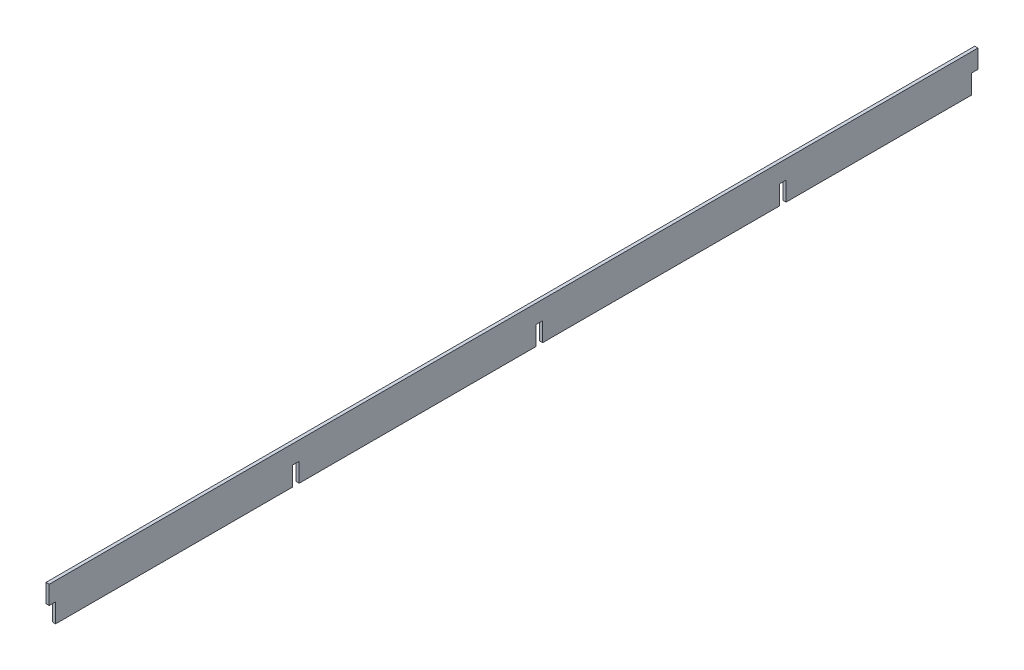
ISO-10303-21;
HEADER;
FILE_DESCRIPTION(('STEP AP214'),'2;1');
FILE_NAME('part.step','',(''),(''),'','','');
FILE_SCHEMA(('AUTOMOTIVE_DESIGN { 1 0 10303 214 1 1 1 1 }'));
ENDSEC;
DATA;
#1=APPLICATION_CONTEXT('core data for automotive mechanical design processes');
#2=APPLICATION_PROTOCOL_DEFINITION('international standard','automotive_design',2000,#1);
#3=PRODUCT_CONTEXT('',#1,'mechanical');
#4=PRODUCT('Part','Part','',(#3));
#5=PRODUCT_RELATED_PRODUCT_CATEGORY('part','',(#4));
#6=PRODUCT_DEFINITION_FORMATION('','',#4);
#7=PRODUCT_DEFINITION_CONTEXT('part definition',#1,'design');
#8=PRODUCT_DEFINITION('design','',#6,#7);
#9=PRODUCT_DEFINITION_SHAPE('','',#8);
#10=(LENGTH_UNIT() NAMED_UNIT(*) SI_UNIT(.MILLI.,.METRE.));
#11=(NAMED_UNIT(*) PLANE_ANGLE_UNIT() SI_UNIT($,.RADIAN.));
#12=(NAMED_UNIT(*) SI_UNIT($,.STERADIAN.) SOLID_ANGLE_UNIT());
#13=UNCERTAINTY_MEASURE_WITH_UNIT(LENGTH_MEASURE(1.E-05),#10,'distance_accuracy_value','');
#14=(GEOMETRIC_REPRESENTATION_CONTEXT(3) GLOBAL_UNCERTAINTY_ASSIGNED_CONTEXT((#13)) GLOBAL_UNIT_ASSIGNED_CONTEXT((#10,
#11,#12)) REPRESENTATION_CONTEXT('',''));
#15=CARTESIAN_POINT('',(0.,0.,0.));
#16=DIRECTION('',(0.,0.,1.));
#17=DIRECTION('',(1.,0.,0.));
#18=AXIS2_PLACEMENT_3D('',#15,#16,#17);
#19=CARTESIAN_POINT('',(788.475040211552,416.670628572467,-319.68119407791));
#20=DIRECTION('',(0.,0.,-1.));
#21=DIRECTION('',(1.,0.,0.));
#22=AXIS2_PLACEMENT_3D('',#19,#20,#21);
#23=PLANE('',#22);
#24=DIRECTION('',(0.,1.,0.));
#25=VECTOR('',#24,1.);
#26=CARTESIAN_POINT('',(330.901436240696,416.670628572467,-319.68119407791));
#27=LINE('',#26,#25);
#28=CARTESIAN_POINT('',(330.901436240696,416.670628572467,-319.68119407791));
#29=VERTEX_POINT('',#28);
#30=CARTESIAN_POINT('',(330.901436240696,425.766786018162,-319.68119407791));
#31=VERTEX_POINT('',#30);
#32=EDGE_CURVE('E245',#29,#31,#27,.T.);
#33=ORIENTED_EDGE('',*,*,#32,.T.);
#34=DIRECTION('',(-1.,0.,0.));
#35=VECTOR('',#34,1.);
#36=CARTESIAN_POINT('',(788.475040211552,425.766786018162,-319.68119407791));
#37=LINE('',#36,#35);
#38=CARTESIAN_POINT('',(329.313936240696,425.766786018162,-319.68119407791));
#39=VERTEX_POINT('',#38);
#40=EDGE_CURVE('E249',#31,#39,#37,.T.);
#41=ORIENTED_EDGE('',*,*,#40,.T.);
#42=DIRECTION('',(0.,1.,0.));
#43=VECTOR('',#42,1.);
#44=CARTESIAN_POINT('',(329.313936240696,416.670628572467,-319.68119407791));
#45=LINE('',#44,#43);
#46=CARTESIAN_POINT('',(329.313936240696,416.670628572467,-319.68119407791));
#47=VERTEX_POINT('',#46);
#48=EDGE_CURVE('E252',#47,#39,#45,.T.);
#49=ORIENTED_EDGE('',*,*,#48,.F.);
#50=DIRECTION('',(-1.,0.,0.));
#51=VECTOR('',#50,1.);
#52=CARTESIAN_POINT('',(788.475040211552,416.670628572467,-319.68119407791));
#53=LINE('',#52,#51);
#54=EDGE_CURVE('E39',#29,#47,#53,.T.);
#55=ORIENTED_EDGE('',*,*,#54,.F.);
#56=EDGE_LOOP('',(#33,#41,#49,#55));
#57=FACE_BOUND('',#56,.T.);
#58=ADVANCED_FACE('F35',(#57),#23,.F.);
#59=CARTESIAN_POINT('',(788.475040211552,425.766786018162,-773.70619407791));
#60=DIRECTION('',(0.,-1.,0.));
#61=DIRECTION('',(0.,0.,1.));
#62=AXIS2_PLACEMENT_3D('',#59,#60,#61);
#63=PLANE('',#62);
#64=DIRECTION('',(0.,0.,-1.));
#65=VECTOR('',#64,1.);
#66=CARTESIAN_POINT('',(330.901436240696,425.766786018162,-773.70619407791));
#67=LINE('',#66,#65);
#68=CARTESIAN_POINT('',(330.901436240696,425.766786018162,-776.88119407791));
#69=VERTEX_POINT('',#68);
#70=EDGE_CURVE('E148',#31,#69,#67,.T.);
#71=ORIENTED_EDGE('',*,*,#70,.T.);
#72=DIRECTION('',(-1.,0.,0.));
#73=VECTOR('',#72,1.);
#74=CARTESIAN_POINT('',(788.475040211552,425.766786018162,-776.88119407791));
#75=LINE('',#74,#73);
#76=CARTESIAN_POINT('',(329.313936240696,425.766786018162,-776.88119407791));
#77=VERTEX_POINT('',#76);
#78=EDGE_CURVE('E253',#69,#77,#75,.T.);
#79=ORIENTED_EDGE('',*,*,#78,.T.);
#80=DIRECTION('',(0.,0.,-1.));
#81=VECTOR('',#80,1.);
#82=CARTESIAN_POINT('',(329.313936240696,425.766786018162,-773.70619407791));
#83=LINE('',#82,#81);
#84=EDGE_CURVE('E139',#39,#77,#83,.T.);
#85=ORIENTED_EDGE('',*,*,#84,.F.);
#86=ORIENTED_EDGE('',*,*,#40,.F.);
#87=EDGE_LOOP('',(#71,#79,#85,#86));
#88=FACE_BOUND('',#87,.T.);
#89=ADVANCED_FACE('F351',(#88),#63,.F.);
#90=CARTESIAN_POINT('',(788.475040211552,425.766786018162,-776.88119407791));
#91=DIRECTION('',(0.,0.,1.));
#92=DIRECTION('',(-1.,0.,0.));
#93=AXIS2_PLACEMENT_3D('',#90,#91,#92);
#94=PLANE('',#93);
#95=DIRECTION('',(0.,-1.,0.));
#96=VECTOR('',#95,1.);
#97=CARTESIAN_POINT('',(330.901436240696,425.766786018162,-776.88119407791));
#98=LINE('',#97,#96);
#99=CARTESIAN_POINT('',(330.901436240696,416.670628572467,-776.88119407791));
#100=VERTEX_POINT('',#99);
#101=EDGE_CURVE('E241',#69,#100,#98,.T.);
#102=ORIENTED_EDGE('',*,*,#101,.T.);
#103=DIRECTION('',(-1.,0.,0.));
#104=VECTOR('',#103,1.);
#105=CARTESIAN_POINT('',(788.475040211552,416.670628572467,-776.88119407791));
#106=LINE('',#105,#104);
#107=CARTESIAN_POINT('',(329.313936240696,416.670628572467,-776.88119407791));
#108=VERTEX_POINT('',#107);
#109=EDGE_CURVE('E256',#100,#108,#106,.T.);
#110=ORIENTED_EDGE('',*,*,#109,.T.);
#111=DIRECTION('',(0.,-1.,0.));
#112=VECTOR('',#111,1.);
#113=CARTESIAN_POINT('',(329.313936240696,425.766786018162,-776.88119407791));
#114=LINE('',#113,#112);
#115=EDGE_CURVE('E255',#77,#108,#114,.T.);
#116=ORIENTED_EDGE('',*,*,#115,.F.);
#117=ORIENTED_EDGE('',*,*,#78,.F.);
#118=EDGE_LOOP('',(#102,#110,#116,#117));
#119=FACE_BOUND('',#118,.T.);
#120=ADVANCED_FACE('F354',(#119),#94,.F.);
#121=CARTESIAN_POINT('',(788.475040211552,416.670628572467,-776.88119407791));
#122=DIRECTION('',(0.,1.,0.));
#123=DIRECTION('',(0.,0.,-1.));
#124=AXIS2_PLACEMENT_3D('',#121,#122,#123);
#125=PLANE('',#124);
#126=DIRECTION('',(0.,0.,1.));
#127=VECTOR('',#126,1.);
#128=CARTESIAN_POINT('',(330.901436240696,416.670628572467,-776.88119407791));
#129=LINE('',#128,#127);
#130=CARTESIAN_POINT('',(330.901436240696,416.670628572467,-773.70619407791));
#131=VERTEX_POINT('',#130);
#132=EDGE_CURVE('E238',#100,#131,#129,.T.);
#133=ORIENTED_EDGE('',*,*,#132,.T.);
#134=DIRECTION('',(-1.,0.,0.));
#135=VECTOR('',#134,1.);
#136=CARTESIAN_POINT('',(788.475040211552,416.670628572467,-773.70619407791));
#137=LINE('',#136,#135);
#138=CARTESIAN_POINT('',(329.313936240696,416.670628572467,-773.70619407791));
#139=VERTEX_POINT('',#138);
#140=EDGE_CURVE('E260',#131,#139,#137,.T.);
#141=ORIENTED_EDGE('',*,*,#140,.T.);
#142=DIRECTION('',(0.,0.,1.));
#143=VECTOR('',#142,1.);
#144=CARTESIAN_POINT('',(329.313936240696,416.670628572467,-776.88119407791));
#145=LINE('',#144,#143);
#146=EDGE_CURVE('E259',#108,#139,#145,.T.);
#147=ORIENTED_EDGE('',*,*,#146,.F.);
#148=ORIENTED_EDGE('',*,*,#109,.F.);
#149=EDGE_LOOP('',(#133,#141,#147,#148));
#150=FACE_BOUND('',#149,.T.);
#151=ADVANCED_FACE('F372',(#150),#125,.F.);
#152=CARTESIAN_POINT('',(788.475040211552,416.670628572467,-773.70619407791));
#153=DIRECTION('',(0.,0.,1.));
#154=DIRECTION('',(-1.,0.,0.));
#155=AXIS2_PLACEMENT_3D('',#152,#153,#154);
#156=PLANE('',#155);
#157=DIRECTION('',(0.,-1.,0.));
#158=VECTOR('',#157,1.);
#159=CARTESIAN_POINT('',(330.901436240696,416.670628572467,-773.70619407791));
#160=LINE('',#159,#158);
#161=CARTESIAN_POINT('',(330.901436240696,407.279951489841,-773.70619407791));
#162=VERTEX_POINT('',#161);
#163=EDGE_CURVE('E235',#131,#162,#160,.T.);
#164=ORIENTED_EDGE('',*,*,#163,.T.);
#165=DIRECTION('',(-1.,0.,0.));
#166=VECTOR('',#165,1.);
#167=CARTESIAN_POINT('',(788.475040211552,407.279951489841,-773.70619407791));
#168=LINE('',#167,#166);
#169=CARTESIAN_POINT('',(329.313936240696,407.279951489841,-773.70619407791));
#170=VERTEX_POINT('',#169);
#171=EDGE_CURVE('E264',#162,#170,#168,.T.);
#172=ORIENTED_EDGE('',*,*,#171,.T.);
#173=DIRECTION('',(0.,-1.,0.));
#174=VECTOR('',#173,1.);
#175=CARTESIAN_POINT('',(329.313936240696,416.670628572467,-773.70619407791));
#176=LINE('',#175,#174);
#177=EDGE_CURVE('E263',#139,#170,#176,.T.);
#178=ORIENTED_EDGE('',*,*,#177,.F.);
#179=ORIENTED_EDGE('',*,*,#140,.F.);
#180=EDGE_LOOP('',(#164,#172,#178,#179));
#181=FACE_BOUND('',#180,.T.);
#182=ADVANCED_FACE('F375',(#181),#156,.F.);
#183=CARTESIAN_POINT('',(788.475040211552,407.279951489841,-773.70619407791));
#184=DIRECTION('',(0.,1.,0.));
#185=DIRECTION('',(0.,0.,-1.));
#186=AXIS2_PLACEMENT_3D('',#183,#184,#185);
#187=PLANE('',#186);
#188=DIRECTION('',(0.,0.,1.));
#189=VECTOR('',#188,1.);
#190=CARTESIAN_POINT('',(330.901436240696,407.279951489841,-773.70619407791));
#191=LINE('',#190,#189);
#192=CARTESIAN_POINT('',(330.901436240696,407.279951489841,-682.42494407791));
#193=VERTEX_POINT('',#192);
#194=EDGE_CURVE('E232',#162,#193,#191,.T.);
#195=ORIENTED_EDGE('',*,*,#194,.T.);
#196=DIRECTION('',(-1.,0.,0.));
#197=VECTOR('',#196,1.);
#198=CARTESIAN_POINT('',(788.475040211552,407.279951489841,-682.42494407791));
#199=LINE('',#198,#197);
#200=CARTESIAN_POINT('',(329.313936240696,407.279951489841,-682.42494407791));
#201=VERTEX_POINT('',#200);
#202=EDGE_CURVE('E268',#193,#201,#199,.T.);
#203=ORIENTED_EDGE('',*,*,#202,.T.);
#204=DIRECTION('',(0.,0.,1.));
#205=VECTOR('',#204,1.);
#206=CARTESIAN_POINT('',(329.313936240696,407.279951489841,-773.70619407791));
#207=LINE('',#206,#205);
#208=EDGE_CURVE('E267',#170,#201,#207,.T.);
#209=ORIENTED_EDGE('',*,*,#208,.F.);
#210=ORIENTED_EDGE('',*,*,#171,.F.);
#211=EDGE_LOOP('',(#195,#203,#209,#210));
#212=FACE_BOUND('',#211,.T.);
#213=ADVANCED_FACE('F379',(#212),#187,.F.);
#214=CARTESIAN_POINT('',(788.475040211552,416.670628572467,-682.42494407791));
#215=DIRECTION('',(0.,0.,-1.));
#216=DIRECTION('',(1.,0.,0.));
#217=AXIS2_PLACEMENT_3D('',#214,#215,#216);
#218=PLANE('',#217);
#219=DIRECTION('',(0.,1.,0.));
#220=VECTOR('',#219,1.);
#221=CARTESIAN_POINT('',(330.901436240696,416.670628572467,-682.42494407791));
#222=LINE('',#221,#220);
#223=CARTESIAN_POINT('',(330.901436240696,416.670628572467,-682.42494407791));
#224=VERTEX_POINT('',#223);
#225=EDGE_CURVE('E229',#193,#224,#222,.T.);
#226=ORIENTED_EDGE('',*,*,#225,.T.);
#227=DIRECTION('',(-1.,0.,0.));
#228=VECTOR('',#227,1.);
#229=CARTESIAN_POINT('',(788.475040211552,416.670628572467,-682.42494407791));
#230=LINE('',#229,#228);
#231=CARTESIAN_POINT('',(329.313936240696,416.670628572467,-682.42494407791));
#232=VERTEX_POINT('',#231);
#233=EDGE_CURVE('E272',#224,#232,#230,.T.);
#234=ORIENTED_EDGE('',*,*,#233,.T.);
#235=DIRECTION('',(0.,1.,0.));
#236=VECTOR('',#235,1.);
#237=CARTESIAN_POINT('',(329.313936240696,416.670628572467,-682.42494407791));
#238=LINE('',#237,#236);
#239=EDGE_CURVE('E271',#201,#232,#238,.T.);
#240=ORIENTED_EDGE('',*,*,#239,.F.);
#241=ORIENTED_EDGE('',*,*,#202,.F.);
#242=EDGE_LOOP('',(#226,#234,#240,#241));
#243=FACE_BOUND('',#242,.T.);
#244=ADVANCED_FACE('F383',(#243),#218,.F.);
#245=CARTESIAN_POINT('',(788.475040211552,416.670628572467,-682.42494407791));
#246=DIRECTION('',(0.,1.,0.));
#247=DIRECTION('',(0.,0.,-1.));
#248=AXIS2_PLACEMENT_3D('',#245,#246,#247);
#249=PLANE('',#248);
#250=DIRECTION('',(0.,0.,1.));
#251=VECTOR('',#250,1.);
#252=CARTESIAN_POINT('',(330.901436240696,416.670628572467,-682.42494407791));
#253=LINE('',#252,#251);
#254=CARTESIAN_POINT('',(330.901436240696,416.670628572467,-679.24994407791));
#255=VERTEX_POINT('',#254);
#256=EDGE_CURVE('E226',#224,#255,#253,.T.);
#257=ORIENTED_EDGE('',*,*,#256,.T.);
#258=DIRECTION('',(-1.,0.,0.));
#259=VECTOR('',#258,1.);
#260=CARTESIAN_POINT('',(788.475040211552,416.670628572467,-679.24994407791));
#261=LINE('',#260,#259);
#262=CARTESIAN_POINT('',(329.313936240696,416.670628572467,-679.24994407791));
#263=VERTEX_POINT('',#262);
#264=EDGE_CURVE('E276',#255,#263,#261,.T.);
#265=ORIENTED_EDGE('',*,*,#264,.T.);
#266=DIRECTION('',(0.,0.,1.));
#267=VECTOR('',#266,1.);
#268=CARTESIAN_POINT('',(329.313936240696,416.670628572467,-682.42494407791));
#269=LINE('',#268,#267);
#270=EDGE_CURVE('E275',#232,#263,#269,.T.);
#271=ORIENTED_EDGE('',*,*,#270,.F.);
#272=ORIENTED_EDGE('',*,*,#233,.F.);
#273=EDGE_LOOP('',(#257,#265,#271,#272));
#274=FACE_BOUND('',#273,.T.);
#275=ADVANCED_FACE('F387',(#274),#249,.F.);
#276=CARTESIAN_POINT('',(788.475040211552,416.670628572467,-679.24994407791));
#277=DIRECTION('',(0.,0.,1.));
#278=DIRECTION('',(-1.,0.,0.));
#279=AXIS2_PLACEMENT_3D('',#276,#277,#278);
#280=PLANE('',#279);
#281=DIRECTION('',(0.,-1.,0.));
#282=VECTOR('',#281,1.);
#283=CARTESIAN_POINT('',(330.901436240696,416.670628572467,-679.24994407791));
#284=LINE('',#283,#282);
#285=CARTESIAN_POINT('',(330.901436240696,407.279951489841,-679.24994407791));
#286=VERTEX_POINT('',#285);
#287=EDGE_CURVE('E223',#255,#286,#284,.T.);
#288=ORIENTED_EDGE('',*,*,#287,.T.);
#289=DIRECTION('',(-1.,0.,0.));
#290=VECTOR('',#289,1.);
#291=CARTESIAN_POINT('',(788.475040211552,407.279951489841,-679.24994407791));
#292=LINE('',#291,#290);
#293=CARTESIAN_POINT('',(329.313936240696,407.279951489841,-679.24994407791));
#294=VERTEX_POINT('',#293);
#295=EDGE_CURVE('E280',#286,#294,#292,.T.);
#296=ORIENTED_EDGE('',*,*,#295,.T.);
#297=DIRECTION('',(0.,-1.,0.));
#298=VECTOR('',#297,1.);
#299=CARTESIAN_POINT('',(329.313936240696,416.670628572467,-679.24994407791));
#300=LINE('',#299,#298);
#301=EDGE_CURVE('E279',#263,#294,#300,.T.);
#302=ORIENTED_EDGE('',*,*,#301,.F.);
#303=ORIENTED_EDGE('',*,*,#264,.F.);
#304=EDGE_LOOP('',(#288,#296,#302,#303));
#305=FACE_BOUND('',#304,.T.);
#306=ADVANCED_FACE('F391',(#305),#280,.F.);
#307=CARTESIAN_POINT('',(788.475040211552,407.279951489841,-679.24994407791));
#308=DIRECTION('',(0.,1.,0.));
#309=DIRECTION('',(0.,0.,-1.));
#310=AXIS2_PLACEMENT_3D('',#307,#308,#309);
#311=PLANE('',#310);
#312=DIRECTION('',(0.,0.,1.));
#313=VECTOR('',#312,1.);
#314=CARTESIAN_POINT('',(330.901436240696,407.279951489841,-679.24994407791));
#315=LINE('',#314,#313);
#316=CARTESIAN_POINT('',(330.901436240696,407.279951489841,-562.56869407791));
#317=VERTEX_POINT('',#316);
#318=EDGE_CURVE('E220',#286,#317,#315,.T.);
#319=ORIENTED_EDGE('',*,*,#318,.T.);
#320=DIRECTION('',(-1.,0.,0.));
#321=VECTOR('',#320,1.);
#322=CARTESIAN_POINT('',(788.475040211552,407.279951489841,-562.56869407791));
#323=LINE('',#322,#321);
#324=CARTESIAN_POINT('',(329.313936240696,407.279951489841,-562.56869407791));
#325=VERTEX_POINT('',#324);
#326=EDGE_CURVE('E284',#317,#325,#323,.T.);
#327=ORIENTED_EDGE('',*,*,#326,.T.);
#328=DIRECTION('',(0.,0.,1.));
#329=VECTOR('',#328,1.);
#330=CARTESIAN_POINT('',(329.313936240696,407.279951489841,-679.24994407791));
#331=LINE('',#330,#329);
#332=EDGE_CURVE('E283',#294,#325,#331,.T.);
#333=ORIENTED_EDGE('',*,*,#332,.F.);
#334=ORIENTED_EDGE('',*,*,#295,.F.);
#335=EDGE_LOOP('',(#319,#327,#333,#334));
#336=FACE_BOUND('',#335,.T.);
#337=ADVANCED_FACE('F395',(#336),#311,.F.);
#338=CARTESIAN_POINT('',(788.475040211552,416.670628572467,-562.56869407791));
#339=DIRECTION('',(0.,0.,-1.));
#340=DIRECTION('',(1.,0.,0.));
#341=AXIS2_PLACEMENT_3D('',#338,#339,#340);
#342=PLANE('',#341);
#343=DIRECTION('',(0.,1.,0.));
#344=VECTOR('',#343,1.);
#345=CARTESIAN_POINT('',(330.901436240696,416.670628572467,-562.56869407791));
#346=LINE('',#345,#344);
#347=CARTESIAN_POINT('',(330.901436240696,416.670628572467,-562.56869407791));
#348=VERTEX_POINT('',#347);
#349=EDGE_CURVE('E217',#317,#348,#346,.T.);
#350=ORIENTED_EDGE('',*,*,#349,.T.);
#351=DIRECTION('',(-1.,0.,0.));
#352=VECTOR('',#351,1.);
#353=CARTESIAN_POINT('',(788.475040211552,416.670628572467,-562.56869407791));
#354=LINE('',#353,#352);
#355=CARTESIAN_POINT('',(329.313936240696,416.670628572467,-562.56869407791));
#356=VERTEX_POINT('',#355);
#357=EDGE_CURVE('E288',#348,#356,#354,.T.);
#358=ORIENTED_EDGE('',*,*,#357,.T.);
#359=DIRECTION('',(0.,1.,0.));
#360=VECTOR('',#359,1.);
#361=CARTESIAN_POINT('',(329.313936240696,416.670628572467,-562.56869407791));
#362=LINE('',#361,#360);
#363=EDGE_CURVE('E287',#325,#356,#362,.T.);
#364=ORIENTED_EDGE('',*,*,#363,.F.);
#365=ORIENTED_EDGE('',*,*,#326,.F.);
#366=EDGE_LOOP('',(#350,#358,#364,#365));
#367=FACE_BOUND('',#366,.T.);
#368=ADVANCED_FACE('F399',(#367),#342,.F.);
#369=CARTESIAN_POINT('',(788.475040211552,416.670628572467,-562.56869407791));
#370=DIRECTION('',(0.,1.,0.));
#371=DIRECTION('',(0.,0.,-1.));
#372=AXIS2_PLACEMENT_3D('',#369,#370,#371);
#373=PLANE('',#372);
#374=DIRECTION('',(0.,0.,1.));
#375=VECTOR('',#374,1.);
#376=CARTESIAN_POINT('',(330.901436240696,416.670628572467,-562.56869407791));
#377=LINE('',#376,#375);
#378=CARTESIAN_POINT('',(330.901436240696,416.670628572467,-559.39369407791));
#379=VERTEX_POINT('',#378);
#380=EDGE_CURVE('E214',#348,#379,#377,.T.);
#381=ORIENTED_EDGE('',*,*,#380,.T.);
#382=DIRECTION('',(-1.,0.,0.));
#383=VECTOR('',#382,1.);
#384=CARTESIAN_POINT('',(788.475040211552,416.670628572467,-559.39369407791));
#385=LINE('',#384,#383);
#386=CARTESIAN_POINT('',(329.313936240696,416.670628572467,-559.39369407791));
#387=VERTEX_POINT('',#386);
#388=EDGE_CURVE('E292',#379,#387,#385,.T.);
#389=ORIENTED_EDGE('',*,*,#388,.T.);
#390=DIRECTION('',(0.,0.,1.));
#391=VECTOR('',#390,1.);
#392=CARTESIAN_POINT('',(329.313936240696,416.670628572467,-562.56869407791));
#393=LINE('',#392,#391);
#394=EDGE_CURVE('E291',#356,#387,#393,.T.);
#395=ORIENTED_EDGE('',*,*,#394,.F.);
#396=ORIENTED_EDGE('',*,*,#357,.F.);
#397=EDGE_LOOP('',(#381,#389,#395,#396));
#398=FACE_BOUND('',#397,.T.);
#399=ADVANCED_FACE('F403',(#398),#373,.F.);
#400=CARTESIAN_POINT('',(788.475040211552,416.670628572467,-559.39369407791));
#401=DIRECTION('',(0.,0.,1.));
#402=DIRECTION('',(0.,1.,0.));
#403=AXIS2_PLACEMENT_3D('',#400,#401,#402);
#404=PLANE('',#403);
#405=DIRECTION('',(0.,-1.,0.));
#406=VECTOR('',#405,1.);
#407=CARTESIAN_POINT('',(330.901436240696,416.670628572467,-559.39369407791));
#408=LINE('',#407,#406);
#409=CARTESIAN_POINT('',(330.901436240696,407.279951489841,-559.39369407791));
#410=VERTEX_POINT('',#409);
#411=EDGE_CURVE('E211',#379,#410,#408,.T.);
#412=ORIENTED_EDGE('',*,*,#411,.T.);
#413=DIRECTION('',(-1.,0.,0.));
#414=VECTOR('',#413,1.);
#415=CARTESIAN_POINT('',(788.475040211552,407.279951489841,-559.39369407791));
#416=LINE('',#415,#414);
#417=CARTESIAN_POINT('',(329.313936240696,407.279951489841,-559.39369407791));
#418=VERTEX_POINT('',#417);
#419=EDGE_CURVE('E296',#410,#418,#416,.T.);
#420=ORIENTED_EDGE('',*,*,#419,.T.);
#421=DIRECTION('',(0.,-1.,0.));
#422=VECTOR('',#421,1.);
#423=CARTESIAN_POINT('',(329.313936240696,416.670628572467,-559.39369407791));
#424=LINE('',#423,#422);
#425=EDGE_CURVE('E295',#387,#418,#424,.T.);
#426=ORIENTED_EDGE('',*,*,#425,.F.);
#427=ORIENTED_EDGE('',*,*,#388,.F.);
#428=EDGE_LOOP('',(#412,#420,#426,#427));
#429=FACE_BOUND('',#428,.T.);
#430=ADVANCED_FACE('F407',(#429),#404,.F.);
#431=CARTESIAN_POINT('',(788.475040211552,407.279951489841,-559.39369407791));
#432=DIRECTION('',(0.,1.,0.));
#433=DIRECTION('',(0.,0.,-1.));
#434=AXIS2_PLACEMENT_3D('',#431,#432,#433);
#435=PLANE('',#434);
#436=DIRECTION('',(0.,0.,1.));
#437=VECTOR('',#436,1.);
#438=CARTESIAN_POINT('',(330.901436240696,407.279951489841,-559.39369407791));
#439=LINE('',#438,#437);
#440=CARTESIAN_POINT('',(330.901436240696,407.279951489841,-442.71244407791));
#441=VERTEX_POINT('',#440);
#442=EDGE_CURVE('E208',#410,#441,#439,.T.);
#443=ORIENTED_EDGE('',*,*,#442,.T.);
#444=DIRECTION('',(-1.,0.,0.));
#445=VECTOR('',#444,1.);
#446=CARTESIAN_POINT('',(788.475040211552,407.279951489841,-442.71244407791));
#447=LINE('',#446,#445);
#448=CARTESIAN_POINT('',(329.313936240696,407.279951489841,-442.71244407791));
#449=VERTEX_POINT('',#448);
#450=EDGE_CURVE('E300',#441,#449,#447,.T.);
#451=ORIENTED_EDGE('',*,*,#450,.T.);
#452=DIRECTION('',(0.,0.,1.));
#453=VECTOR('',#452,1.);
#454=CARTESIAN_POINT('',(329.313936240696,407.279951489841,-559.39369407791));
#455=LINE('',#454,#453);
#456=EDGE_CURVE('E299',#418,#449,#455,.T.);
#457=ORIENTED_EDGE('',*,*,#456,.F.);
#458=ORIENTED_EDGE('',*,*,#419,.F.);
#459=EDGE_LOOP('',(#443,#451,#457,#458));
#460=FACE_BOUND('',#459,.T.);
#461=ADVANCED_FACE('F411',(#460),#435,.F.);
#462=CARTESIAN_POINT('',(788.475040211552,416.670628572467,-442.71244407791));
#463=DIRECTION('',(0.,0.,-1.));
#464=DIRECTION('',(1.,0.,0.));
#465=AXIS2_PLACEMENT_3D('',#462,#463,#464);
#466=PLANE('',#465);
#467=DIRECTION('',(0.,1.,0.));
#468=VECTOR('',#467,1.);
#469=CARTESIAN_POINT('',(330.901436240696,416.670628572467,-442.71244407791));
#470=LINE('',#469,#468);
#471=CARTESIAN_POINT('',(330.901436240696,416.670628572467,-442.71244407791));
#472=VERTEX_POINT('',#471);
#473=EDGE_CURVE('E205',#441,#472,#470,.T.);
#474=ORIENTED_EDGE('',*,*,#473,.T.);
#475=DIRECTION('',(-1.,0.,0.));
#476=VECTOR('',#475,1.);
#477=CARTESIAN_POINT('',(788.475040211552,416.670628572467,-442.71244407791));
#478=LINE('',#477,#476);
#479=CARTESIAN_POINT('',(329.313936240696,416.670628572467,-442.71244407791));
#480=VERTEX_POINT('',#479);
#481=EDGE_CURVE('E304',#472,#480,#478,.T.);
#482=ORIENTED_EDGE('',*,*,#481,.T.);
#483=DIRECTION('',(0.,1.,0.));
#484=VECTOR('',#483,1.);
#485=CARTESIAN_POINT('',(329.313936240696,416.670628572467,-442.71244407791));
#486=LINE('',#485,#484);
#487=EDGE_CURVE('E303',#449,#480,#486,.T.);
#488=ORIENTED_EDGE('',*,*,#487,.F.);
#489=ORIENTED_EDGE('',*,*,#450,.F.);
#490=EDGE_LOOP('',(#474,#482,#488,#489));
#491=FACE_BOUND('',#490,.T.);
#492=ADVANCED_FACE('F415',(#491),#466,.F.);
#493=CARTESIAN_POINT('',(788.475040211552,416.670628572467,-442.71244407791));
#494=DIRECTION('',(0.,1.,0.));
#495=DIRECTION('',(0.,0.,-1.));
#496=AXIS2_PLACEMENT_3D('',#493,#494,#495);
#497=PLANE('',#496);
#498=DIRECTION('',(0.,0.,1.));
#499=VECTOR('',#498,1.);
#500=CARTESIAN_POINT('',(330.901436240696,416.670628572467,-442.71244407791));
#501=LINE('',#500,#499);
#502=CARTESIAN_POINT('',(330.901436240696,416.670628572467,-439.53744407791));
#503=VERTEX_POINT('',#502);
#504=EDGE_CURVE('E199',#472,#503,#501,.T.);
#505=ORIENTED_EDGE('',*,*,#504,.T.);
#506=DIRECTION('',(-1.,0.,0.));
#507=VECTOR('',#506,1.);
#508=CARTESIAN_POINT('',(788.475040211552,416.670628572467,-439.53744407791));
#509=LINE('',#508,#507);
#510=CARTESIAN_POINT('',(329.313936240696,416.670628572467,-439.53744407791));
#511=VERTEX_POINT('',#510);
#512=EDGE_CURVE('E308',#503,#511,#509,.T.);
#513=ORIENTED_EDGE('',*,*,#512,.T.);
#514=DIRECTION('',(0.,0.,1.));
#515=VECTOR('',#514,1.);
#516=CARTESIAN_POINT('',(329.313936240696,416.670628572467,-442.71244407791));
#517=LINE('',#516,#515);
#518=EDGE_CURVE('E307',#480,#511,#517,.T.);
#519=ORIENTED_EDGE('',*,*,#518,.F.);
#520=ORIENTED_EDGE('',*,*,#481,.F.);
#521=EDGE_LOOP('',(#505,#513,#519,#520));
#522=FACE_BOUND('',#521,.T.);
#523=ADVANCED_FACE('F419',(#522),#497,.F.);
#524=CARTESIAN_POINT('',(788.475040211552,416.670628572467,-439.53744407791));
#525=DIRECTION('',(0.,0.,1.));
#526=DIRECTION('',(0.,1.,0.));
#527=AXIS2_PLACEMENT_3D('',#524,#525,#526);
#528=PLANE('',#527);
#529=DIRECTION('',(0.,-1.,0.));
#530=VECTOR('',#529,1.);
#531=CARTESIAN_POINT('',(330.901436240696,416.670628572467,-439.53744407791));
#532=LINE('',#531,#530);
#533=CARTESIAN_POINT('',(330.901436240696,407.279951489841,-439.53744407791));
#534=VERTEX_POINT('',#533);
#535=EDGE_CURVE('E197',#503,#534,#532,.T.);
#536=ORIENTED_EDGE('',*,*,#535,.T.);
#537=DIRECTION('',(-1.,0.,0.));
#538=VECTOR('',#537,1.);
#539=CARTESIAN_POINT('',(788.475040211552,407.279951489841,-439.53744407791));
#540=LINE('',#539,#538);
#541=CARTESIAN_POINT('',(329.313936240696,407.279951489841,-439.53744407791));
#542=VERTEX_POINT('',#541);
#543=EDGE_CURVE('E195',#534,#542,#540,.T.);
#544=ORIENTED_EDGE('',*,*,#543,.T.);
#545=DIRECTION('',(0.,-1.,0.));
#546=VECTOR('',#545,1.);
#547=CARTESIAN_POINT('',(329.313936240696,416.670628572467,-439.53744407791));
#548=LINE('',#547,#546);
#549=EDGE_CURVE('E311',#511,#542,#548,.T.);
#550=ORIENTED_EDGE('',*,*,#549,.F.);
#551=ORIENTED_EDGE('',*,*,#512,.F.);
#552=EDGE_LOOP('',(#536,#544,#550,#551));
#553=FACE_BOUND('',#552,.T.);
#554=ADVANCED_FACE('F423',(#553),#528,.F.);
#555=CARTESIAN_POINT('',(788.475040211552,407.279951489841,-439.53744407791));
#556=DIRECTION('',(0.,1.,0.));
#557=DIRECTION('',(0.,0.,-1.));
#558=AXIS2_PLACEMENT_3D('',#555,#556,#557);
#559=PLANE('',#558);
#560=DIRECTION('',(0.,0.,1.));
#561=VECTOR('',#560,1.);
#562=CARTESIAN_POINT('',(330.901436240696,407.279951489841,-439.53744407791));
#563=LINE('',#562,#561);
#564=CARTESIAN_POINT('',(330.901436240696,407.279951489841,-322.85619407791));
#565=VERTEX_POINT('',#564);
#566=EDGE_CURVE('E44',#534,#565,#563,.T.);
#567=ORIENTED_EDGE('',*,*,#566,.T.);
#568=DIRECTION('',(-1.,0.,0.));
#569=VECTOR('',#568,1.);
#570=CARTESIAN_POINT('',(788.475040211552,407.279951489841,-322.85619407791));
#571=LINE('',#570,#569);
#572=CARTESIAN_POINT('',(329.313936240696,407.279951489841,-322.85619407791));
#573=VERTEX_POINT('',#572);
#574=EDGE_CURVE('E186',#565,#573,#571,.T.);
#575=ORIENTED_EDGE('',*,*,#574,.T.);
#576=DIRECTION('',(0.,0.,1.));
#577=VECTOR('',#576,1.);
#578=CARTESIAN_POINT('',(329.313936240696,407.279951489841,-439.53744407791));
#579=LINE('',#578,#577);
#580=EDGE_CURVE('E191',#542,#573,#579,.T.);
#581=ORIENTED_EDGE('',*,*,#580,.F.);
#582=ORIENTED_EDGE('',*,*,#543,.F.);
#583=EDGE_LOOP('',(#567,#575,#581,#582));
#584=FACE_BOUND('',#583,.T.);
#585=ADVANCED_FACE('F193',(#584),#559,.F.);
#586=CARTESIAN_POINT('',(788.475040211552,407.279951489841,-322.85619407791));
#587=DIRECTION('',(0.,0.,-1.));
#588=DIRECTION('',(1.,0.,0.));
#589=AXIS2_PLACEMENT_3D('',#586,#587,#588);
#590=PLANE('',#589);
#591=DIRECTION('',(0.,1.,0.));
#592=VECTOR('',#591,1.);
#593=CARTESIAN_POINT('',(330.901436240696,407.279951489841,-322.85619407791));
#594=LINE('',#593,#592);
#595=CARTESIAN_POINT('',(330.901436240696,416.670628572467,-322.85619407791));
#596=VERTEX_POINT('',#595);
#597=EDGE_CURVE('E11',#565,#596,#594,.T.);
#598=ORIENTED_EDGE('',*,*,#597,.T.);
#599=DIRECTION('',(-1.,0.,0.));
#600=VECTOR('',#599,1.);
#601=CARTESIAN_POINT('',(788.475040211552,416.670628572467,-322.85619407791));
#602=LINE('',#601,#600);
#603=CARTESIAN_POINT('',(329.313936240696,416.670628572467,-322.85619407791));
#604=VERTEX_POINT('',#603);
#605=EDGE_CURVE('E312',#596,#604,#602,.T.);
#606=ORIENTED_EDGE('',*,*,#605,.T.);
#607=DIRECTION('',(0.,1.,0.));
#608=VECTOR('',#607,1.);
#609=CARTESIAN_POINT('',(329.313936240696,407.279951489841,-322.85619407791));
#610=LINE('',#609,#608);
#611=EDGE_CURVE('E188',#573,#604,#610,.T.);
#612=ORIENTED_EDGE('',*,*,#611,.F.);
#613=ORIENTED_EDGE('',*,*,#574,.F.);
#614=EDGE_LOOP('',(#598,#606,#612,#613));
#615=FACE_BOUND('',#614,.T.);
#616=ADVANCED_FACE('F187',(#615),#590,.F.);
#617=CARTESIAN_POINT('',(788.475040211552,416.670628572467,-322.85619407791));
#618=DIRECTION('',(0.,1.,0.));
#619=DIRECTION('',(0.,0.,-1.));
#620=AXIS2_PLACEMENT_3D('',#617,#618,#619);
#621=PLANE('',#620);
#622=DIRECTION('',(0.,0.,1.));
#623=VECTOR('',#622,1.);
#624=CARTESIAN_POINT('',(330.901436240696,416.670628572467,-322.85619407791));
#625=LINE('',#624,#623);
#626=EDGE_CURVE('E52',#596,#29,#625,.T.);
#627=ORIENTED_EDGE('',*,*,#626,.T.);
#628=ORIENTED_EDGE('',*,*,#54,.T.);
#629=DIRECTION('',(0.,0.,1.));
#630=VECTOR('',#629,1.);
#631=CARTESIAN_POINT('',(329.313936240696,416.670628572467,-322.85619407791));
#632=LINE('',#631,#630);
#633=EDGE_CURVE('E58',#604,#47,#632,.T.);
#634=ORIENTED_EDGE('',*,*,#633,.F.);
#635=ORIENTED_EDGE('',*,*,#605,.F.);
#636=EDGE_LOOP('',(#627,#628,#634,#635));
#637=FACE_BOUND('',#636,.T.);
#638=ADVANCED_FACE('F349',(#637),#621,.F.);
#639=CARTESIAN_POINT('',(329.313936240696,0.,0.));
#640=DIRECTION('',(1.,0.,0.));
#641=DIRECTION('',(0.,0.,1.));
#642=AXIS2_PLACEMENT_3D('',#639,#640,#641);
#643=PLANE('',#642);
#644=ORIENTED_EDGE('',*,*,#48,.T.);
#645=ORIENTED_EDGE('',*,*,#84,.T.);
#646=ORIENTED_EDGE('',*,*,#115,.T.);
#647=ORIENTED_EDGE('',*,*,#146,.T.);
#648=ORIENTED_EDGE('',*,*,#177,.T.);
#649=ORIENTED_EDGE('',*,*,#208,.T.);
#650=ORIENTED_EDGE('',*,*,#239,.T.);
#651=ORIENTED_EDGE('',*,*,#270,.T.);
#652=ORIENTED_EDGE('',*,*,#301,.T.);
#653=ORIENTED_EDGE('',*,*,#332,.T.);
#654=ORIENTED_EDGE('',*,*,#363,.T.);
#655=ORIENTED_EDGE('',*,*,#394,.T.);
#656=ORIENTED_EDGE('',*,*,#425,.T.);
#657=ORIENTED_EDGE('',*,*,#456,.T.);
#658=ORIENTED_EDGE('',*,*,#487,.T.);
#659=ORIENTED_EDGE('',*,*,#518,.T.);
#660=ORIENTED_EDGE('',*,*,#549,.T.);
#661=ORIENTED_EDGE('',*,*,#580,.T.);
#662=ORIENTED_EDGE('',*,*,#611,.T.);
#663=ORIENTED_EDGE('',*,*,#633,.T.);
#664=EDGE_LOOP('',(#644,#645,#646,#647,#648,#649,#650,#651,#652,#653,#654,#655,#656,#657,#658,
#659,#660,#661,#662,#663));
#665=FACE_BOUND('',#664,.T.);
#666=ADVANCED_FACE('F356',(#665),#643,.F.);
#667=CARTESIAN_POINT('',(330.901436240696,442.854809491684,-802.28119407791));
#668=DIRECTION('',(1.,0.,0.));
#669=DIRECTION('',(0.,0.,1.));
#670=AXIS2_PLACEMENT_3D('',#667,#668,#669);
#671=PLANE('',#670);
#672=ORIENTED_EDGE('',*,*,#626,.F.);
#673=ORIENTED_EDGE('',*,*,#597,.F.);
#674=ORIENTED_EDGE('',*,*,#566,.F.);
#675=ORIENTED_EDGE('',*,*,#535,.F.);
#676=ORIENTED_EDGE('',*,*,#504,.F.);
#677=ORIENTED_EDGE('',*,*,#473,.F.);
#678=ORIENTED_EDGE('',*,*,#442,.F.);
#679=ORIENTED_EDGE('',*,*,#411,.F.);
#680=ORIENTED_EDGE('',*,*,#380,.F.);
#681=ORIENTED_EDGE('',*,*,#349,.F.);
#682=ORIENTED_EDGE('',*,*,#318,.F.);
#683=ORIENTED_EDGE('',*,*,#287,.F.);
#684=ORIENTED_EDGE('',*,*,#256,.F.);
#685=ORIENTED_EDGE('',*,*,#225,.F.);
#686=ORIENTED_EDGE('',*,*,#194,.F.);
#687=ORIENTED_EDGE('',*,*,#163,.F.);
#688=ORIENTED_EDGE('',*,*,#132,.F.);
#689=ORIENTED_EDGE('',*,*,#101,.F.);
#690=ORIENTED_EDGE('',*,*,#70,.F.);
#691=ORIENTED_EDGE('',*,*,#32,.F.);
#692=EDGE_LOOP('',(#672,#673,#674,#675,#676,#677,#678,#679,#680,#681,#682,#683,#684,#685,#686,
#687,#688,#689,#690,#691));
#693=FACE_BOUND('',#692,.T.);
#694=ADVANCED_FACE('F37',(#693),#671,.T.);
#695=CLOSED_SHELL('',(#58,#89,#120,#151,#182,#213,#244,#275,#306,#337,#368,#399,#430,#461,#492,
#523,#554,#585,#616,#638,#666,#694));
#696=MANIFOLD_SOLID_BREP('B2',#695);
#697=ADVANCED_BREP_SHAPE_REPRESENTATION('',(#18,#696),#14);
#698=SHAPE_DEFINITION_REPRESENTATION(#9,#697);
ENDSEC;
END-ISO-10303-21;
